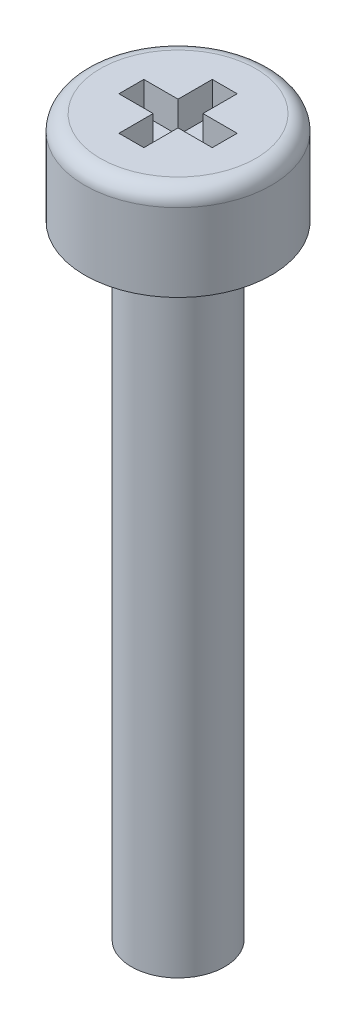
ISO-10303-21;
HEADER;
FILE_DESCRIPTION(('STEP AP214'),'2;1');
FILE_NAME('part.step','',(''),(''),'','','');
FILE_SCHEMA(('AUTOMOTIVE_DESIGN { 1 0 10303 214 1 1 1 1 }'));
ENDSEC;
DATA;
#1=APPLICATION_CONTEXT('core data for automotive mechanical design processes');
#2=APPLICATION_PROTOCOL_DEFINITION('international standard','automotive_design',2000,#1);
#3=PRODUCT_CONTEXT('',#1,'mechanical');
#4=PRODUCT('Part','Part','',(#3));
#5=PRODUCT_RELATED_PRODUCT_CATEGORY('part','',(#4));
#6=PRODUCT_DEFINITION_FORMATION('','',#4);
#7=PRODUCT_DEFINITION_CONTEXT('part definition',#1,'design');
#8=PRODUCT_DEFINITION('design','',#6,#7);
#9=PRODUCT_DEFINITION_SHAPE('','',#8);
#10=(LENGTH_UNIT() NAMED_UNIT(*) SI_UNIT(.MILLI.,.METRE.));
#11=(NAMED_UNIT(*) PLANE_ANGLE_UNIT() SI_UNIT($,.RADIAN.));
#12=(NAMED_UNIT(*) SI_UNIT($,.STERADIAN.) SOLID_ANGLE_UNIT());
#13=UNCERTAINTY_MEASURE_WITH_UNIT(LENGTH_MEASURE(1.E-05),#10,'distance_accuracy_value','');
#14=(GEOMETRIC_REPRESENTATION_CONTEXT(3) GLOBAL_UNCERTAINTY_ASSIGNED_CONTEXT((#13)) GLOBAL_UNIT_ASSIGNED_CONTEXT((#10,
#11,#12)) REPRESENTATION_CONTEXT('',''));
#15=CARTESIAN_POINT('',(0.,0.,0.));
#16=DIRECTION('',(0.,0.,1.));
#17=DIRECTION('',(1.,0.,0.));
#18=AXIS2_PLACEMENT_3D('',#15,#16,#17);
#19=CARTESIAN_POINT('',(0.,3.,0.));
#20=DIRECTION('',(0.,-1.,0.));
#21=DIRECTION('',(0.,0.,-1.));
#22=AXIS2_PLACEMENT_3D('',#19,#20,#21);
#23=CYLINDRICAL_SURFACE('',#22,3.);
#24=CARTESIAN_POINT('',(0.,2.5,0.));
#25=DIRECTION('',(0.,1.,0.));
#26=DIRECTION('',(0.,0.,1.));
#27=AXIS2_PLACEMENT_3D('',#24,#25,#26);
#28=CIRCLE('',#27,3.);
#29=CARTESIAN_POINT('',(0.,2.5,3.));
#30=VERTEX_POINT('',#29);
#31=EDGE_CURVE('E11',#30,#30,#28,.F.);
#32=ORIENTED_EDGE('',*,*,#31,.T.);
#33=EDGE_LOOP('',(#32));
#34=FACE_BOUND('',#33,.T.);
#35=CARTESIAN_POINT('',(0.,0.,0.));
#36=DIRECTION('',(0.,1.,0.));
#37=DIRECTION('',(0.,0.,1.));
#38=AXIS2_PLACEMENT_3D('',#35,#36,#37);
#39=CIRCLE('',#38,3.);
#40=CARTESIAN_POINT('',(0.,0.,3.));
#41=VERTEX_POINT('',#40);
#42=EDGE_CURVE('E211',#41,#41,#39,.T.);
#43=ORIENTED_EDGE('',*,*,#42,.T.);
#44=EDGE_LOOP('',(#43));
#45=FACE_BOUND('',#44,.T.);
#46=ADVANCED_FACE('F33',(#34,#45),#23,.T.);
#47=CARTESIAN_POINT('',(0.,3.,0.));
#48=DIRECTION('',(0.,1.,0.));
#49=DIRECTION('',(0.,0.,1.));
#50=AXIS2_PLACEMENT_3D('',#47,#48,#49);
#51=PLANE('',#50);
#52=DIRECTION('',(0.,0.,1.));
#53=VECTOR('',#52,1.);
#54=CARTESIAN_POINT('',(-0.4,3.,0.));
#55=LINE('',#54,#53);
#56=CARTESIAN_POINT('',(-0.4,3.,-1.5));
#57=VERTEX_POINT('',#56);
#58=CARTESIAN_POINT('',(-0.4,3.,-0.4));
#59=VERTEX_POINT('',#58);
#60=EDGE_CURVE('E48',#57,#59,#55,.T.);
#61=ORIENTED_EDGE('',*,*,#60,.F.);
#62=DIRECTION('',(-1.,0.,0.));
#63=VECTOR('',#62,1.);
#64=CARTESIAN_POINT('',(0.,3.,-1.5));
#65=LINE('',#64,#63);
#66=CARTESIAN_POINT('',(0.4,3.,-1.5));
#67=VERTEX_POINT('',#66);
#68=EDGE_CURVE('E187',#67,#57,#65,.T.);
#69=ORIENTED_EDGE('',*,*,#68,.F.);
#70=DIRECTION('',(0.,0.,1.));
#71=VECTOR('',#70,1.);
#72=CARTESIAN_POINT('',(0.4,3.,0.));
#73=LINE('',#72,#71);
#74=CARTESIAN_POINT('',(0.4,3.,-0.4));
#75=VERTEX_POINT('',#74);
#76=EDGE_CURVE('E185',#67,#75,#73,.T.);
#77=ORIENTED_EDGE('',*,*,#76,.T.);
#78=DIRECTION('',(1.,0.,0.));
#79=VECTOR('',#78,1.);
#80=CARTESIAN_POINT('',(0.,3.,-0.4));
#81=LINE('',#80,#79);
#82=CARTESIAN_POINT('',(1.5,3.,-0.4));
#83=VERTEX_POINT('',#82);
#84=EDGE_CURVE('E143',#75,#83,#81,.T.);
#85=ORIENTED_EDGE('',*,*,#84,.T.);
#86=DIRECTION('',(0.,0.,1.));
#87=VECTOR('',#86,1.);
#88=CARTESIAN_POINT('',(1.5,3.,0.));
#89=LINE('',#88,#87);
#90=CARTESIAN_POINT('',(1.5,3.,0.4));
#91=VERTEX_POINT('',#90);
#92=EDGE_CURVE('E181',#83,#91,#89,.T.);
#93=ORIENTED_EDGE('',*,*,#92,.T.);
#94=DIRECTION('',(1.,0.,0.));
#95=VECTOR('',#94,1.);
#96=CARTESIAN_POINT('',(0.,3.,0.4));
#97=LINE('',#96,#95);
#98=CARTESIAN_POINT('',(0.4,3.,0.4));
#99=VERTEX_POINT('',#98);
#100=EDGE_CURVE('E178',#99,#91,#97,.T.);
#101=ORIENTED_EDGE('',*,*,#100,.F.);
#102=DIRECTION('',(0.,0.,1.));
#103=VECTOR('',#102,1.);
#104=CARTESIAN_POINT('',(0.4,3.,0.));
#105=LINE('',#104,#103);
#106=CARTESIAN_POINT('',(0.4,3.,1.5));
#107=VERTEX_POINT('',#106);
#108=EDGE_CURVE('E175',#99,#107,#105,.T.);
#109=ORIENTED_EDGE('',*,*,#108,.T.);
#110=DIRECTION('',(-1.,0.,0.));
#111=VECTOR('',#110,1.);
#112=CARTESIAN_POINT('',(0.,3.,1.5));
#113=LINE('',#112,#111);
#114=CARTESIAN_POINT('',(-0.4,3.,1.5));
#115=VERTEX_POINT('',#114);
#116=EDGE_CURVE('E172',#107,#115,#113,.T.);
#117=ORIENTED_EDGE('',*,*,#116,.T.);
#118=DIRECTION('',(0.,0.,1.));
#119=VECTOR('',#118,1.);
#120=CARTESIAN_POINT('',(-0.4,3.,0.));
#121=LINE('',#120,#119);
#122=CARTESIAN_POINT('',(-0.4,3.,0.4));
#123=VERTEX_POINT('',#122);
#124=EDGE_CURVE('E169',#123,#115,#121,.T.);
#125=ORIENTED_EDGE('',*,*,#124,.F.);
#126=DIRECTION('',(1.,0.,0.));
#127=VECTOR('',#126,1.);
#128=CARTESIAN_POINT('',(0.,3.,0.4));
#129=LINE('',#128,#127);
#130=CARTESIAN_POINT('',(-1.5,3.,0.4));
#131=VERTEX_POINT('',#130);
#132=EDGE_CURVE('E166',#131,#123,#129,.T.);
#133=ORIENTED_EDGE('',*,*,#132,.F.);
#134=DIRECTION('',(0.,0.,1.));
#135=VECTOR('',#134,1.);
#136=CARTESIAN_POINT('',(-1.5,3.,0.));
#137=LINE('',#136,#135);
#138=CARTESIAN_POINT('',(-1.5,3.,-0.4));
#139=VERTEX_POINT('',#138);
#140=EDGE_CURVE('E163',#139,#131,#137,.T.);
#141=ORIENTED_EDGE('',*,*,#140,.F.);
#142=DIRECTION('',(1.,0.,0.));
#143=VECTOR('',#142,1.);
#144=CARTESIAN_POINT('',(0.,3.,-0.4));
#145=LINE('',#144,#143);
#146=EDGE_CURVE('E160',#139,#59,#145,.T.);
#147=ORIENTED_EDGE('',*,*,#146,.T.);
#148=EDGE_LOOP('',(#61,#69,#77,#85,#93,#101,#109,#117,#125,#133,#141,#147));
#149=FACE_BOUND('',#148,.T.);
#150=CARTESIAN_POINT('',(0.,3.,0.));
#151=DIRECTION('',(0.,1.,0.));
#152=DIRECTION('',(0.,0.,1.));
#153=AXIS2_PLACEMENT_3D('',#150,#151,#152);
#154=CIRCLE('',#153,2.5);
#155=CARTESIAN_POINT('',(0.,3.,2.5));
#156=VERTEX_POINT('',#155);
#157=EDGE_CURVE('E41',#156,#156,#154,.T.);
#158=ORIENTED_EDGE('',*,*,#157,.T.);
#159=EDGE_LOOP('',(#158));
#160=FACE_BOUND('',#159,.T.);
#161=ADVANCED_FACE('F219',(#149,#160),#51,.T.);
#162=CARTESIAN_POINT('',(0.,0.,0.));
#163=DIRECTION('',(0.,1.,0.));
#164=DIRECTION('',(0.,0.,1.));
#165=AXIS2_PLACEMENT_3D('',#162,#163,#164);
#166=PLANE('',#165);
#167=CARTESIAN_POINT('',(0.,0.,0.));
#168=DIRECTION('',(0.,-1.,0.));
#169=DIRECTION('',(0.,0.,-1.));
#170=AXIS2_PLACEMENT_3D('',#167,#168,#169);
#171=CIRCLE('',#170,1.5);
#172=CARTESIAN_POINT('',(0.,0.,-1.5));
#173=VERTEX_POINT('',#172);
#174=EDGE_CURVE('E212',#173,#173,#171,.T.);
#175=ORIENTED_EDGE('',*,*,#174,.F.);
#176=EDGE_LOOP('',(#175));
#177=FACE_BOUND('',#176,.T.);
#178=ORIENTED_EDGE('',*,*,#42,.F.);
#179=EDGE_LOOP('',(#178));
#180=FACE_BOUND('',#179,.T.);
#181=ADVANCED_FACE('F240',(#177,#180),#166,.F.);
#182=CARTESIAN_POINT('',(0.,-20.,0.));
#183=DIRECTION('',(0.,1.,0.));
#184=DIRECTION('',(0.,0.,1.));
#185=AXIS2_PLACEMENT_3D('',#182,#183,#184);
#186=CYLINDRICAL_SURFACE('',#185,1.5);
#187=CARTESIAN_POINT('',(0.,-20.,0.));
#188=DIRECTION('',(0.,-1.,0.));
#189=DIRECTION('',(0.,0.,-1.));
#190=AXIS2_PLACEMENT_3D('',#187,#188,#189);
#191=CIRCLE('',#190,1.5);
#192=CARTESIAN_POINT('',(0.,-20.,-1.5));
#193=VERTEX_POINT('',#192);
#194=EDGE_CURVE('E191',#193,#193,#191,.T.);
#195=ORIENTED_EDGE('',*,*,#194,.F.);
#196=EDGE_LOOP('',(#195));
#197=FACE_BOUND('',#196,.T.);
#198=ORIENTED_EDGE('',*,*,#174,.T.);
#199=EDGE_LOOP('',(#198));
#200=FACE_BOUND('',#199,.T.);
#201=ADVANCED_FACE('F231',(#197,#200),#186,.T.);
#202=CARTESIAN_POINT('',(0.,-20.,0.));
#203=DIRECTION('',(0.,-1.,0.));
#204=DIRECTION('',(0.,0.,-1.));
#205=AXIS2_PLACEMENT_3D('',#202,#203,#204);
#206=PLANE('',#205);
#207=ORIENTED_EDGE('',*,*,#194,.T.);
#208=EDGE_LOOP('',(#207));
#209=FACE_BOUND('',#208,.T.);
#210=ADVANCED_FACE('F223',(#209),#206,.T.);
#211=CARTESIAN_POINT('',(0.,2.5,0.));
#212=DIRECTION('',(0.,1.,0.));
#213=DIRECTION('',(0.,0.,1.));
#214=AXIS2_PLACEMENT_3D('',#211,#212,#213);
#215=TOROIDAL_SURFACE('',#214,2.5,0.5);
#216=ORIENTED_EDGE('',*,*,#31,.F.);
#217=EDGE_LOOP('',(#216));
#218=FACE_BOUND('',#217,.T.);
#219=ORIENTED_EDGE('',*,*,#157,.F.);
#220=EDGE_LOOP('',(#219));
#221=FACE_BOUND('',#220,.T.);
#222=ADVANCED_FACE('F35',(#218,#221),#215,.T.);
#223=CARTESIAN_POINT('',(-0.4,2.,0.));
#224=DIRECTION('',(-1.,0.,0.));
#225=DIRECTION('',(0.,0.,1.));
#226=AXIS2_PLACEMENT_3D('',#223,#224,#225);
#227=PLANE('',#226);
#228=ORIENTED_EDGE('',*,*,#60,.T.);
#229=DIRECTION('',(0.,1.,0.));
#230=VECTOR('',#229,1.);
#231=CARTESIAN_POINT('',(-0.4,2.,-0.4));
#232=LINE('',#231,#230);
#233=CARTESIAN_POINT('',(-0.4,2.,-0.4));
#234=VERTEX_POINT('',#233);
#235=EDGE_CURVE('E158',#234,#59,#232,.T.);
#236=ORIENTED_EDGE('',*,*,#235,.F.);
#237=DIRECTION('',(0.,0.,1.));
#238=VECTOR('',#237,1.);
#239=CARTESIAN_POINT('',(-0.4,2.,0.));
#240=LINE('',#239,#238);
#241=CARTESIAN_POINT('',(-0.4,2.,-1.5));
#242=VERTEX_POINT('',#241);
#243=EDGE_CURVE('E189',#242,#234,#240,.T.);
#244=ORIENTED_EDGE('',*,*,#243,.F.);
#245=DIRECTION('',(0.,1.,0.));
#246=VECTOR('',#245,1.);
#247=CARTESIAN_POINT('',(-0.4,2.,-1.5));
#248=LINE('',#247,#246);
#249=EDGE_CURVE('E56',#242,#57,#248,.T.);
#250=ORIENTED_EDGE('',*,*,#249,.T.);
#251=EDGE_LOOP('',(#228,#236,#244,#250));
#252=FACE_BOUND('',#251,.T.);
#253=ADVANCED_FACE('F222',(#252),#227,.F.);
#254=CARTESIAN_POINT('',(0.,2.,-1.5));
#255=DIRECTION('',(0.,0.,-1.));
#256=DIRECTION('',(-1.,0.,0.));
#257=AXIS2_PLACEMENT_3D('',#254,#255,#256);
#258=PLANE('',#257);
#259=ORIENTED_EDGE('',*,*,#68,.T.);
#260=ORIENTED_EDGE('',*,*,#249,.F.);
#261=DIRECTION('',(-1.,0.,0.));
#262=VECTOR('',#261,1.);
#263=CARTESIAN_POINT('',(0.,2.,-1.5));
#264=LINE('',#263,#262);
#265=CARTESIAN_POINT('',(0.4,2.,-1.5));
#266=VERTEX_POINT('',#265);
#267=EDGE_CURVE('E136',#266,#242,#264,.T.);
#268=ORIENTED_EDGE('',*,*,#267,.F.);
#269=DIRECTION('',(0.,1.,0.));
#270=VECTOR('',#269,1.);
#271=CARTESIAN_POINT('',(0.4,2.,-1.5));
#272=LINE('',#271,#270);
#273=EDGE_CURVE('E132',#266,#67,#272,.T.);
#274=ORIENTED_EDGE('',*,*,#273,.T.);
#275=EDGE_LOOP('',(#259,#260,#268,#274));
#276=FACE_BOUND('',#275,.T.);
#277=ADVANCED_FACE('F229',(#276),#258,.F.);
#278=CARTESIAN_POINT('',(0.4,2.,0.));
#279=DIRECTION('',(-1.,0.,0.));
#280=DIRECTION('',(0.,0.,1.));
#281=AXIS2_PLACEMENT_3D('',#278,#279,#280);
#282=PLANE('',#281);
#283=ORIENTED_EDGE('',*,*,#76,.F.);
#284=ORIENTED_EDGE('',*,*,#273,.F.);
#285=DIRECTION('',(0.,0.,1.));
#286=VECTOR('',#285,1.);
#287=CARTESIAN_POINT('',(0.4,2.,0.));
#288=LINE('',#287,#286);
#289=CARTESIAN_POINT('',(0.4,2.,-0.4));
#290=VERTEX_POINT('',#289);
#291=EDGE_CURVE('E126',#266,#290,#288,.T.);
#292=ORIENTED_EDGE('',*,*,#291,.T.);
#293=DIRECTION('',(0.,1.,0.));
#294=VECTOR('',#293,1.);
#295=CARTESIAN_POINT('',(0.4,2.,-0.4));
#296=LINE('',#295,#294);
#297=EDGE_CURVE('E130',#290,#75,#296,.T.);
#298=ORIENTED_EDGE('',*,*,#297,.T.);
#299=EDGE_LOOP('',(#283,#284,#292,#298));
#300=FACE_BOUND('',#299,.T.);
#301=ADVANCED_FACE('F129',(#300),#282,.T.);
#302=CARTESIAN_POINT('',(0.,2.,-0.4));
#303=DIRECTION('',(0.,0.,1.));
#304=DIRECTION('',(1.,0.,0.));
#305=AXIS2_PLACEMENT_3D('',#302,#303,#304);
#306=PLANE('',#305);
#307=ORIENTED_EDGE('',*,*,#84,.F.);
#308=ORIENTED_EDGE('',*,*,#297,.F.);
#309=DIRECTION('',(1.,0.,0.));
#310=VECTOR('',#309,1.);
#311=CARTESIAN_POINT('',(0.,2.,-0.4));
#312=LINE('',#311,#310);
#313=CARTESIAN_POINT('',(1.5,2.,-0.4));
#314=VERTEX_POINT('',#313);
#315=EDGE_CURVE('E137',#290,#314,#312,.T.);
#316=ORIENTED_EDGE('',*,*,#315,.T.);
#317=DIRECTION('',(0.,1.,0.));
#318=VECTOR('',#317,1.);
#319=CARTESIAN_POINT('',(1.5,2.,-0.4));
#320=LINE('',#319,#318);
#321=EDGE_CURVE('E145',#314,#83,#320,.T.);
#322=ORIENTED_EDGE('',*,*,#321,.T.);
#323=EDGE_LOOP('',(#307,#308,#316,#322));
#324=FACE_BOUND('',#323,.T.);
#325=ADVANCED_FACE('F140',(#324),#306,.T.);
#326=CARTESIAN_POINT('',(1.5,2.,0.));
#327=DIRECTION('',(-1.,0.,0.));
#328=DIRECTION('',(0.,0.,1.));
#329=AXIS2_PLACEMENT_3D('',#326,#327,#328);
#330=PLANE('',#329);
#331=ORIENTED_EDGE('',*,*,#92,.F.);
#332=ORIENTED_EDGE('',*,*,#321,.F.);
#333=DIRECTION('',(0.,0.,1.));
#334=VECTOR('',#333,1.);
#335=CARTESIAN_POINT('',(1.5,2.,0.));
#336=LINE('',#335,#334);
#337=CARTESIAN_POINT('',(1.5,2.,0.4));
#338=VERTEX_POINT('',#337);
#339=EDGE_CURVE('E151',#314,#338,#336,.T.);
#340=ORIENTED_EDGE('',*,*,#339,.T.);
#341=DIRECTION('',(0.,1.,0.));
#342=VECTOR('',#341,1.);
#343=CARTESIAN_POINT('',(1.5,2.,0.4));
#344=LINE('',#343,#342);
#345=EDGE_CURVE('E194',#338,#91,#344,.T.);
#346=ORIENTED_EDGE('',*,*,#345,.T.);
#347=EDGE_LOOP('',(#331,#332,#340,#346));
#348=FACE_BOUND('',#347,.T.);
#349=ADVANCED_FACE('F277',(#348),#330,.T.);
#350=CARTESIAN_POINT('',(0.,2.,0.4));
#351=DIRECTION('',(0.,0.,1.));
#352=DIRECTION('',(1.,0.,0.));
#353=AXIS2_PLACEMENT_3D('',#350,#351,#352);
#354=PLANE('',#353);
#355=ORIENTED_EDGE('',*,*,#100,.T.);
#356=ORIENTED_EDGE('',*,*,#345,.F.);
#357=DIRECTION('',(1.,0.,0.));
#358=VECTOR('',#357,1.);
#359=CARTESIAN_POINT('',(0.,2.,0.4));
#360=LINE('',#359,#358);
#361=CARTESIAN_POINT('',(0.4,2.,0.4));
#362=VERTEX_POINT('',#361);
#363=EDGE_CURVE('E153',#362,#338,#360,.T.);
#364=ORIENTED_EDGE('',*,*,#363,.F.);
#365=DIRECTION('',(0.,1.,0.));
#366=VECTOR('',#365,1.);
#367=CARTESIAN_POINT('',(0.4,2.,0.4));
#368=LINE('',#367,#366);
#369=EDGE_CURVE('E196',#362,#99,#368,.T.);
#370=ORIENTED_EDGE('',*,*,#369,.T.);
#371=EDGE_LOOP('',(#355,#356,#364,#370));
#372=FACE_BOUND('',#371,.T.);
#373=ADVANCED_FACE('F273',(#372),#354,.F.);
#374=CARTESIAN_POINT('',(0.4,2.,0.));
#375=DIRECTION('',(-1.,0.,0.));
#376=DIRECTION('',(0.,0.,1.));
#377=AXIS2_PLACEMENT_3D('',#374,#375,#376);
#378=PLANE('',#377);
#379=ORIENTED_EDGE('',*,*,#108,.F.);
#380=ORIENTED_EDGE('',*,*,#369,.F.);
#381=DIRECTION('',(0.,0.,1.));
#382=VECTOR('',#381,1.);
#383=CARTESIAN_POINT('',(0.4,2.,0.));
#384=LINE('',#383,#382);
#385=CARTESIAN_POINT('',(0.4,2.,1.5));
#386=VERTEX_POINT('',#385);
#387=EDGE_CURVE('E427',#362,#386,#384,.T.);
#388=ORIENTED_EDGE('',*,*,#387,.T.);
#389=DIRECTION('',(0.,1.,0.));
#390=VECTOR('',#389,1.);
#391=CARTESIAN_POINT('',(0.4,2.,1.5));
#392=LINE('',#391,#390);
#393=EDGE_CURVE('E198',#386,#107,#392,.T.);
#394=ORIENTED_EDGE('',*,*,#393,.T.);
#395=EDGE_LOOP('',(#379,#380,#388,#394));
#396=FACE_BOUND('',#395,.T.);
#397=ADVANCED_FACE('F269',(#396),#378,.T.);
#398=CARTESIAN_POINT('',(0.,2.,1.5));
#399=DIRECTION('',(0.,0.,-1.));
#400=DIRECTION('',(-1.,0.,0.));
#401=AXIS2_PLACEMENT_3D('',#398,#399,#400);
#402=PLANE('',#401);
#403=ORIENTED_EDGE('',*,*,#116,.F.);
#404=ORIENTED_EDGE('',*,*,#393,.F.);
#405=DIRECTION('',(-1.,0.,0.));
#406=VECTOR('',#405,1.);
#407=CARTESIAN_POINT('',(0.,2.,1.5));
#408=LINE('',#407,#406);
#409=CARTESIAN_POINT('',(-0.4,2.,1.5));
#410=VERTEX_POINT('',#409);
#411=EDGE_CURVE('E425',#386,#410,#408,.T.);
#412=ORIENTED_EDGE('',*,*,#411,.T.);
#413=DIRECTION('',(0.,1.,0.));
#414=VECTOR('',#413,1.);
#415=CARTESIAN_POINT('',(-0.4,2.,1.5));
#416=LINE('',#415,#414);
#417=EDGE_CURVE('E200',#410,#115,#416,.T.);
#418=ORIENTED_EDGE('',*,*,#417,.T.);
#419=EDGE_LOOP('',(#403,#404,#412,#418));
#420=FACE_BOUND('',#419,.T.);
#421=ADVANCED_FACE('F265',(#420),#402,.T.);
#422=CARTESIAN_POINT('',(-0.4,2.,0.));
#423=DIRECTION('',(-1.,0.,0.));
#424=DIRECTION('',(0.,0.,1.));
#425=AXIS2_PLACEMENT_3D('',#422,#423,#424);
#426=PLANE('',#425);
#427=ORIENTED_EDGE('',*,*,#124,.T.);
#428=ORIENTED_EDGE('',*,*,#417,.F.);
#429=DIRECTION('',(0.,0.,1.));
#430=VECTOR('',#429,1.);
#431=CARTESIAN_POINT('',(-0.4,2.,0.));
#432=LINE('',#431,#430);
#433=CARTESIAN_POINT('',(-0.4,2.,0.4));
#434=VERTEX_POINT('',#433);
#435=EDGE_CURVE('E422',#434,#410,#432,.T.);
#436=ORIENTED_EDGE('',*,*,#435,.F.);
#437=DIRECTION('',(0.,1.,0.));
#438=VECTOR('',#437,1.);
#439=CARTESIAN_POINT('',(-0.4,2.,0.4));
#440=LINE('',#439,#438);
#441=EDGE_CURVE('E202',#434,#123,#440,.T.);
#442=ORIENTED_EDGE('',*,*,#441,.T.);
#443=EDGE_LOOP('',(#427,#428,#436,#442));
#444=FACE_BOUND('',#443,.T.);
#445=ADVANCED_FACE('F261',(#444),#426,.F.);
#446=CARTESIAN_POINT('',(0.,2.,0.4));
#447=DIRECTION('',(0.,0.,1.));
#448=DIRECTION('',(1.,0.,0.));
#449=AXIS2_PLACEMENT_3D('',#446,#447,#448);
#450=PLANE('',#449);
#451=ORIENTED_EDGE('',*,*,#132,.T.);
#452=ORIENTED_EDGE('',*,*,#441,.F.);
#453=DIRECTION('',(1.,0.,0.));
#454=VECTOR('',#453,1.);
#455=CARTESIAN_POINT('',(0.,2.,0.4));
#456=LINE('',#455,#454);
#457=CARTESIAN_POINT('',(-1.5,2.,0.4));
#458=VERTEX_POINT('',#457);
#459=EDGE_CURVE('E419',#458,#434,#456,.T.);
#460=ORIENTED_EDGE('',*,*,#459,.F.);
#461=DIRECTION('',(0.,1.,0.));
#462=VECTOR('',#461,1.);
#463=CARTESIAN_POINT('',(-1.5,2.,0.4));
#464=LINE('',#463,#462);
#465=EDGE_CURVE('E204',#458,#131,#464,.T.);
#466=ORIENTED_EDGE('',*,*,#465,.T.);
#467=EDGE_LOOP('',(#451,#452,#460,#466));
#468=FACE_BOUND('',#467,.T.);
#469=ADVANCED_FACE('F257',(#468),#450,.F.);
#470=CARTESIAN_POINT('',(-1.5,2.,0.));
#471=DIRECTION('',(-1.,0.,0.));
#472=DIRECTION('',(0.,0.,1.));
#473=AXIS2_PLACEMENT_3D('',#470,#471,#472);
#474=PLANE('',#473);
#475=ORIENTED_EDGE('',*,*,#140,.T.);
#476=ORIENTED_EDGE('',*,*,#465,.F.);
#477=DIRECTION('',(0.,0.,1.));
#478=VECTOR('',#477,1.);
#479=CARTESIAN_POINT('',(-1.5,2.,0.));
#480=LINE('',#479,#478);
#481=CARTESIAN_POINT('',(-1.5,2.,-0.4));
#482=VERTEX_POINT('',#481);
#483=EDGE_CURVE('E415',#482,#458,#480,.T.);
#484=ORIENTED_EDGE('',*,*,#483,.F.);
#485=DIRECTION('',(0.,1.,0.));
#486=VECTOR('',#485,1.);
#487=CARTESIAN_POINT('',(-1.5,2.,-0.4));
#488=LINE('',#487,#486);
#489=EDGE_CURVE('E206',#482,#139,#488,.T.);
#490=ORIENTED_EDGE('',*,*,#489,.T.);
#491=EDGE_LOOP('',(#475,#476,#484,#490));
#492=FACE_BOUND('',#491,.T.);
#493=ADVANCED_FACE('F254',(#492),#474,.F.);
#494=CARTESIAN_POINT('',(0.,2.,-0.4));
#495=DIRECTION('',(0.,0.,1.));
#496=DIRECTION('',(1.,0.,0.));
#497=AXIS2_PLACEMENT_3D('',#494,#495,#496);
#498=PLANE('',#497);
#499=ORIENTED_EDGE('',*,*,#146,.F.);
#500=ORIENTED_EDGE('',*,*,#489,.F.);
#501=DIRECTION('',(1.,0.,0.));
#502=VECTOR('',#501,1.);
#503=CARTESIAN_POINT('',(0.,2.,-0.4));
#504=LINE('',#503,#502);
#505=EDGE_CURVE('E100',#482,#234,#504,.T.);
#506=ORIENTED_EDGE('',*,*,#505,.T.);
#507=ORIENTED_EDGE('',*,*,#235,.T.);
#508=EDGE_LOOP('',(#499,#500,#506,#507));
#509=FACE_BOUND('',#508,.T.);
#510=ADVANCED_FACE('F251',(#509),#498,.T.);
#511=CARTESIAN_POINT('',(0.,2.,0.));
#512=DIRECTION('',(0.,1.,0.));
#513=DIRECTION('',(0.,0.,1.));
#514=AXIS2_PLACEMENT_3D('',#511,#512,#513);
#515=PLANE('',#514);
#516=ORIENTED_EDGE('',*,*,#243,.T.);
#517=ORIENTED_EDGE('',*,*,#505,.F.);
#518=ORIENTED_EDGE('',*,*,#483,.T.);
#519=ORIENTED_EDGE('',*,*,#459,.T.);
#520=ORIENTED_EDGE('',*,*,#435,.T.);
#521=ORIENTED_EDGE('',*,*,#411,.F.);
#522=ORIENTED_EDGE('',*,*,#387,.F.);
#523=ORIENTED_EDGE('',*,*,#363,.T.);
#524=ORIENTED_EDGE('',*,*,#339,.F.);
#525=ORIENTED_EDGE('',*,*,#315,.F.);
#526=ORIENTED_EDGE('',*,*,#291,.F.);
#527=ORIENTED_EDGE('',*,*,#267,.T.);
#528=EDGE_LOOP('',(#516,#517,#518,#519,#520,#521,#522,#523,#524,#525,#526,#527));
#529=FACE_BOUND('',#528,.T.);
#530=ADVANCED_FACE('F149',(#529),#515,.T.);
#531=CLOSED_SHELL('',(#46,#161,#181,#201,#210,#222,#253,#277,#301,#325,#349,#373,#397,#421,#445,
#469,#493,#510,#530));
#532=MANIFOLD_SOLID_BREP('B2',#531);
#533=ADVANCED_BREP_SHAPE_REPRESENTATION('',(#18,#532),#14);
#534=SHAPE_DEFINITION_REPRESENTATION(#9,#533);
ENDSEC;
END-ISO-10303-21;
